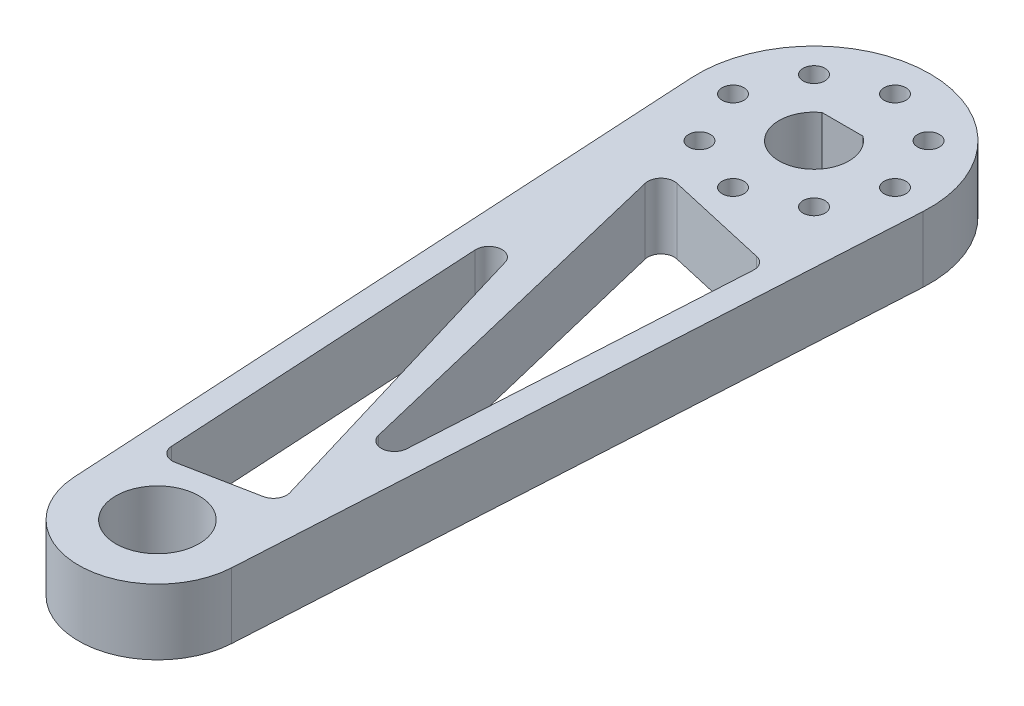
ISO-10303-21;
HEADER;
FILE_DESCRIPTION(('STEP AP214'),'2;1');
FILE_NAME('part.step','',(''),(''),'','','');
FILE_SCHEMA(('AUTOMOTIVE_DESIGN { 1 0 10303 214 1 1 1 1 }'));
ENDSEC;
DATA;
#1=APPLICATION_CONTEXT('core data for automotive mechanical design processes');
#2=APPLICATION_PROTOCOL_DEFINITION('international standard','automotive_design',2000,#1);
#3=PRODUCT_CONTEXT('',#1,'mechanical');
#4=PRODUCT('Part','Part','',(#3));
#5=PRODUCT_RELATED_PRODUCT_CATEGORY('part','',(#4));
#6=PRODUCT_DEFINITION_FORMATION('','',#4);
#7=PRODUCT_DEFINITION_CONTEXT('part definition',#1,'design');
#8=PRODUCT_DEFINITION('design','',#6,#7);
#9=PRODUCT_DEFINITION_SHAPE('','',#8);
#10=(LENGTH_UNIT() NAMED_UNIT(*) SI_UNIT(.MILLI.,.METRE.));
#11=(NAMED_UNIT(*) PLANE_ANGLE_UNIT() SI_UNIT($,.RADIAN.));
#12=(NAMED_UNIT(*) SI_UNIT($,.STERADIAN.) SOLID_ANGLE_UNIT());
#13=UNCERTAINTY_MEASURE_WITH_UNIT(LENGTH_MEASURE(1.E-05),#10,'distance_accuracy_value','');
#14=(GEOMETRIC_REPRESENTATION_CONTEXT(3) GLOBAL_UNCERTAINTY_ASSIGNED_CONTEXT((#13)) GLOBAL_UNIT_ASSIGNED_CONTEXT((#10,
#11,#12)) REPRESENTATION_CONTEXT('',''));
#15=CARTESIAN_POINT('',(0.,0.,0.));
#16=DIRECTION('',(0.,0.,1.));
#17=DIRECTION('',(1.,0.,0.));
#18=AXIS2_PLACEMENT_3D('',#15,#16,#17);
#19=CARTESIAN_POINT('',(0.,15.,0.));
#20=DIRECTION('',(0.,1.,0.));
#21=DIRECTION('',(0.,0.,1.));
#22=AXIS2_PLACEMENT_3D('',#19,#20,#21);
#23=PLANE('',#22);
#24=CARTESIAN_POINT('',(0.,15.,0.));
#25=DIRECTION('',(0.,1.,0.));
#26=DIRECTION('',(0.,0.,1.));
#27=AXIS2_PLACEMENT_3D('',#24,#25,#26);
#28=CIRCLE('',#27,9.5);
#29=CARTESIAN_POINT('',(0.,15.,9.5));
#30=VERTEX_POINT('',#29);
#31=EDGE_CURVE('E640',#30,#30,#28,.T.);
#32=ORIENTED_EDGE('',*,*,#31,.F.);
#33=EDGE_LOOP('',(#32));
#34=FACE_BOUND('',#33,.T.);
#35=CARTESIAN_POINT('',(-13.0814754519499,15.,-163.081475451949));
#36=DIRECTION('',(0.,1.,0.));
#37=DIRECTION('',(0.,0.,1.));
#38=AXIS2_PLACEMENT_3D('',#35,#36,#37);
#39=CIRCLE('',#38,2.49999999999997);
#40=CARTESIAN_POINT('',(-13.0814754519499,15.,-160.581475451949));
#41=VERTEX_POINT('',#40);
#42=EDGE_CURVE('E636',#41,#41,#39,.T.);
#43=ORIENTED_EDGE('',*,*,#42,.F.);
#44=EDGE_LOOP('',(#43));
#45=FACE_BOUND('',#44,.T.);
#46=CARTESIAN_POINT('',(-18.499999999997,15.,-149.999999999997));
#47=DIRECTION('',(0.,1.,0.));
#48=DIRECTION('',(0.,0.,1.));
#49=AXIS2_PLACEMENT_3D('',#46,#47,#48);
#50=CIRCLE('',#49,2.49999999999998);
#51=CARTESIAN_POINT('',(-18.499999999997,15.,-147.499999999997));
#52=VERTEX_POINT('',#51);
#53=EDGE_CURVE('E643',#52,#52,#50,.T.);
#54=ORIENTED_EDGE('',*,*,#53,.F.);
#55=EDGE_LOOP('',(#54));
#56=FACE_BOUND('',#55,.T.);
#57=CARTESIAN_POINT('',(-13.0814754519466,15.,-136.918524548047));
#58=DIRECTION('',(0.,1.,0.));
#59=DIRECTION('',(0.,0.,1.));
#60=AXIS2_PLACEMENT_3D('',#57,#58,#59);
#61=CIRCLE('',#60,2.5);
#62=CARTESIAN_POINT('',(-13.0814754519466,15.,-134.418524548047));
#63=VERTEX_POINT('',#62);
#64=EDGE_CURVE('E649',#63,#63,#61,.T.);
#65=ORIENTED_EDGE('',*,*,#64,.F.);
#66=EDGE_LOOP('',(#65));
#67=FACE_BOUND('',#66,.T.);
#68=CARTESIAN_POINT('',(5.16253706450698E-12,15.,-131.5));
#69=DIRECTION('',(0.,1.,0.));
#70=DIRECTION('',(0.,0.,1.));
#71=AXIS2_PLACEMENT_3D('',#68,#69,#70);
#72=CIRCLE('',#71,2.50000000000003);
#73=CARTESIAN_POINT('',(5.16253706450698E-12,15.,-129.));
#74=VERTEX_POINT('',#73);
#75=EDGE_CURVE('E655',#74,#74,#72,.T.);
#76=ORIENTED_EDGE('',*,*,#75,.F.);
#77=EDGE_LOOP('',(#76));
#78=FACE_BOUND('',#77,.T.);
#79=CARTESIAN_POINT('',(1.94289029309402E-13,15.,-168.5));
#80=DIRECTION('',(0.,1.,0.));
#81=DIRECTION('',(0.,0.,1.));
#82=AXIS2_PLACEMENT_3D('',#79,#80,#81);
#83=CIRCLE('',#82,2.49999999999999);
#84=CARTESIAN_POINT('',(1.94289029309402E-13,15.,-166.));
#85=VERTEX_POINT('',#84);
#86=EDGE_CURVE('E661',#85,#85,#83,.T.);
#87=ORIENTED_EDGE('',*,*,#86,.F.);
#88=EDGE_LOOP('',(#87));
#89=FACE_BOUND('',#88,.T.);
#90=CARTESIAN_POINT('',(13.0814754519556,15.,-136.918524548051));
#91=DIRECTION('',(0.,1.,0.));
#92=DIRECTION('',(0.,0.,1.));
#93=AXIS2_PLACEMENT_3D('',#90,#91,#92);
#94=CIRCLE('',#93,2.49999999999997);
#95=CARTESIAN_POINT('',(13.0814754519556,15.,-134.418524548051));
#96=VERTEX_POINT('',#95);
#97=EDGE_CURVE('E667',#96,#96,#94,.T.);
#98=ORIENTED_EDGE('',*,*,#97,.F.);
#99=EDGE_LOOP('',(#98));
#100=FACE_BOUND('',#99,.T.);
#101=CARTESIAN_POINT('',(18.5000000000028,15.,-150.000000000002));
#102=DIRECTION('',(0.,1.,0.));
#103=DIRECTION('',(0.,0.,1.));
#104=AXIS2_PLACEMENT_3D('',#101,#102,#103);
#105=CIRCLE('',#104,2.50000000000001);
#106=CARTESIAN_POINT('',(18.5000000000028,15.,-147.500000000002));
#107=VERTEX_POINT('',#106);
#108=EDGE_CURVE('E633',#107,#107,#105,.T.);
#109=ORIENTED_EDGE('',*,*,#108,.F.);
#110=EDGE_LOOP('',(#109));
#111=FACE_BOUND('',#110,.T.);
#112=CARTESIAN_POINT('',(13.0814754519523,15.,-163.081475451953));
#113=DIRECTION('',(0.,1.,0.));
#114=DIRECTION('',(0.,0.,1.));
#115=AXIS2_PLACEMENT_3D('',#112,#113,#114);
#116=CIRCLE('',#115,2.49999999999996);
#117=CARTESIAN_POINT('',(13.0814754519523,15.,-160.581475451953));
#118=VERTEX_POINT('',#117);
#119=EDGE_CURVE('E628',#118,#118,#116,.T.);
#120=ORIENTED_EDGE('',*,*,#119,.F.);
#121=EDGE_LOOP('',(#120));
#122=FACE_BOUND('',#121,.T.);
#123=CARTESIAN_POINT('',(0.,15.,0.));
#124=DIRECTION('',(0.,1.,0.));
#125=DIRECTION('',(0.,0.,1.));
#126=AXIS2_PLACEMENT_3D('',#123,#124,#125);
#127=CIRCLE('',#126,18.);
#128=CARTESIAN_POINT('',(-17.971076762398,15.,1.02));
#129=VERTEX_POINT('',#128);
#130=CARTESIAN_POINT('',(17.971076762398,15.,1.02));
#131=VERTEX_POINT('',#130);
#132=EDGE_CURVE('E221',#129,#131,#127,.T.);
#133=ORIENTED_EDGE('',*,*,#132,.T.);
#134=DIRECTION('',(0.0566666666666667,0.,-0.998393153466553));
#135=VECTOR('',#134,1.);
#136=CARTESIAN_POINT('',(17.971076762398,15.,1.02));
#137=LINE('',#136,#135);
#138=CARTESIAN_POINT('',(26.4574185668637,15.,-148.498333333333));
#139=VERTEX_POINT('',#138);
#140=EDGE_CURVE('E224',#131,#139,#137,.T.);
#141=ORIENTED_EDGE('',*,*,#140,.T.);
#142=CARTESIAN_POINT('',(0.,15.,-150.));
#143=DIRECTION('',(0.,1.,0.));
#144=DIRECTION('',(0.,0.,-1.));
#145=AXIS2_PLACEMENT_3D('',#142,#143,#144);
#146=CIRCLE('',#145,26.5);
#147=CARTESIAN_POINT('',(-26.4574185668637,15.,-148.498333333333));
#148=VERTEX_POINT('',#147);
#149=EDGE_CURVE('E227',#139,#148,#146,.T.);
#150=ORIENTED_EDGE('',*,*,#149,.T.);
#151=DIRECTION('',(0.0566666666666667,0.,0.998393153466553));
#152=VECTOR('',#151,1.);
#153=CARTESIAN_POINT('',(-17.971076762398,15.,1.02));
#154=LINE('',#153,#152);
#155=EDGE_CURVE('E229',#148,#129,#154,.T.);
#156=ORIENTED_EDGE('',*,*,#155,.T.);
#157=EDGE_LOOP('',(#133,#141,#150,#156));
#158=FACE_BOUND('',#157,.T.);
#159=DIRECTION('',(-0.286666756449605,0.,-0.958030360033889));
#160=VECTOR('',#159,1.);
#161=CARTESIAN_POINT('',(-18.5543851913669,15.,-115.139490738387));
#162=LINE('',#161,#160);
#163=CARTESIAN_POINT('',(9.76560528215196,15.,-20.4950645568282));
#164=VERTEX_POINT('',#163);
#165=CARTESIAN_POINT('',(-11.2390630531947,15.,-90.6919378076061));
#166=VERTEX_POINT('',#165);
#167=EDGE_CURVE('E206',#164,#166,#162,.T.);
#168=ORIENTED_EDGE('',*,*,#167,.F.);
#169=CARTESIAN_POINT('',(6.8915142020503,15.,-19.6350642874794));
#170=DIRECTION('',(0.,1.,0.));
#171=DIRECTION('',(0.,0.,1.));
#172=AXIS2_PLACEMENT_3D('',#169,#170,#171);
#173=CIRCLE('',#172,3.);
#174=CARTESIAN_POINT('',(7.47066200637673,15.,-16.6914970943031));
#175=VERTEX_POINT('',#174);
#176=EDGE_CURVE('E11',#164,#175,#173,.F.);
#177=ORIENTED_EDGE('',*,*,#176,.T.);
#178=DIRECTION('',(0.981189064392104,0.,-0.19304926810881));
#179=VECTOR('',#178,1.);
#180=CARTESIAN_POINT('',(10.7128519545465,15.,-17.3293990229714));
#181=LINE('',#180,#179);
#182=CARTESIAN_POINT('',(-9.3618110753663,15.,-13.3797025311371));
#183=VERTEX_POINT('',#182);
#184=EDGE_CURVE('E204',#183,#175,#181,.T.);
#185=ORIENTED_EDGE('',*,*,#184,.F.);
#186=CARTESIAN_POINT('',(-9.94095887969273,15.,-16.3232697243134));
#187=DIRECTION('',(0.,1.,0.));
#188=DIRECTION('',(0.,0.,1.));
#189=AXIS2_PLACEMENT_3D('',#186,#187,#188);
#190=CIRCLE('',#189,3.);
#191=CARTESIAN_POINT('',(-12.9361383400924,15.,-16.1532697243134));
#192=VERTEX_POINT('',#191);
#193=EDGE_CURVE('E293',#183,#192,#190,.F.);
#194=ORIENTED_EDGE('',*,*,#193,.T.);
#195=DIRECTION('',(0.0566666666666666,0.,0.998393153466553));
#196=VECTOR('',#195,1.);
#197=CARTESIAN_POINT('',(-12.7409809539486,15.,-12.7148497565296));
#198=LINE('',#197,#196);
#199=CARTESIAN_POINT('',(-17.108333593696,15.,-89.6619375382572));
#200=VERTEX_POINT('',#199);
#201=EDGE_CURVE('E210',#200,#192,#198,.T.);
#202=ORIENTED_EDGE('',*,*,#201,.F.);
#203=CARTESIAN_POINT('',(-14.1131541332963,15.,-89.8319375382572));
#204=DIRECTION('',(0.,1.,0.));
#205=DIRECTION('',(0.,0.,1.));
#206=AXIS2_PLACEMENT_3D('',#203,#204,#205);
#207=CIRCLE('',#206,3.);
#208=EDGE_CURVE('E289',#200,#166,#207,.F.);
#209=ORIENTED_EDGE('',*,*,#208,.T.);
#210=EDGE_LOOP('',(#168,#177,#185,#194,#202,#209));
#211=FACE_BOUND('',#210,.T.);
#212=DIRECTION('',(0.234668209936248,0.,0.972075527541619));
#213=VECTOR('',#212,1.);
#214=CARTESIAN_POINT('',(-12.,15.,-127.));
#215=LINE('',#214,#213);
#216=CARTESIAN_POINT('',(-10.8653488920019,15.,-122.299889257763));
#217=VERTEX_POINT('',#216);
#218=CARTESIAN_POINT('',(8.52161939319863,15.,-41.992473829023));
#219=VERTEX_POINT('',#218);
#220=EDGE_CURVE('E189',#217,#219,#215,.T.);
#221=ORIENTED_EDGE('',*,*,#220,.F.);
#222=CARTESIAN_POINT('',(-7.94912230937701,15.,-123.003893887571));
#223=DIRECTION('',(0.,1.,0.));
#224=DIRECTION('',(0.,0.,1.));
#225=AXIS2_PLACEMENT_3D('',#222,#223,#224);
#226=CIRCLE('',#225,3.);
#227=CARTESIAN_POINT('',(-7.28487950298156,15.,-125.929433409463));
#228=VERTEX_POINT('',#227);
#229=EDGE_CURVE('E285',#217,#228,#226,.F.);
#230=ORIENTED_EDGE('',*,*,#229,.T.);
#231=DIRECTION('',(-0.975179840630658,0.,-0.221414268798477));
#232=VECTOR('',#231,1.);
#233=CARTESIAN_POINT('',(18.8302573337206,15.,-120.));
#234=LINE('',#233,#232);
#235=CARTESIAN_POINT('',(16.3555160897141,15.,-120.561889202563));
#236=VERTEX_POINT('',#235);
#237=EDGE_CURVE('E186',#236,#228,#234,.T.);
#238=ORIENTED_EDGE('',*,*,#237,.F.);
#239=CARTESIAN_POINT('',(15.6912732833187,15.,-117.636349680671));
#240=DIRECTION('',(0.,1.,0.));
#241=DIRECTION('',(0.,0.,1.));
#242=AXIS2_PLACEMENT_3D('',#239,#240,#241);
#243=CIRCLE('',#242,3.);
#244=CARTESIAN_POINT('',(18.6864527437183,15.,-117.466349680671));
#245=VERTEX_POINT('',#244);
#246=EDGE_CURVE('E281',#236,#245,#243,.F.);
#247=ORIENTED_EDGE('',*,*,#246,.T.);
#248=DIRECTION('',(0.0566666666666667,0.,-0.998393153466553));
#249=VECTOR('',#248,1.);
#250=CARTESIAN_POINT('',(13.2832157063432,15.,-22.2683226570439));
#251=LINE('',#250,#249);
#252=CARTESIAN_POINT('',(14.4330254362231,15.,-42.5264784588318));
#253=VERTEX_POINT('',#252);
#254=EDGE_CURVE('E193',#253,#245,#251,.T.);
#255=ORIENTED_EDGE('',*,*,#254,.F.);
#256=CARTESIAN_POINT('',(11.4378459758235,15.,-42.6964784588318));
#257=DIRECTION('',(0.,1.,0.));
#258=DIRECTION('',(0.,0.,1.));
#259=AXIS2_PLACEMENT_3D('',#256,#257,#258);
#260=CIRCLE('',#259,3.);
#261=EDGE_CURVE('E297',#253,#219,#260,.F.);
#262=ORIENTED_EDGE('',*,*,#261,.T.);
#263=EDGE_LOOP('',(#221,#230,#238,#247,#255,#262));
#264=FACE_BOUND('',#263,.T.);
#265=DIRECTION('',(-1.,0.,0.));
#266=VECTOR('',#265,1.);
#267=CARTESIAN_POINT('',(0.,15.,-156.5));
#268=LINE('',#267,#266);
#269=CARTESIAN_POINT('',(4.6636895265444,15.,-156.5));
#270=VERTEX_POINT('',#269);
#271=CARTESIAN_POINT('',(-4.6636895265444,15.,-156.5));
#272=VERTEX_POINT('',#271);
#273=EDGE_CURVE('E159',#270,#272,#268,.T.);
#274=ORIENTED_EDGE('',*,*,#273,.F.);
#275=CARTESIAN_POINT('',(0.,15.,-150.));
#276=DIRECTION('',(0.,1.,0.));
#277=DIRECTION('',(0.,0.,1.));
#278=AXIS2_PLACEMENT_3D('',#275,#276,#277);
#279=CIRCLE('',#278,8.);
#280=EDGE_CURVE('E169',#272,#270,#279,.T.);
#281=ORIENTED_EDGE('',*,*,#280,.F.);
#282=EDGE_LOOP('',(#274,#281));
#283=FACE_BOUND('',#282,.T.);
#284=ADVANCED_FACE('F35',(#34,#45,#56,#67,#78,#89,#100,#111,#122,#158,#211,#264,#283),#23,.T.);
#285=CARTESIAN_POINT('',(0.,0.,0.));
#286=DIRECTION('',(0.,1.,0.));
#287=DIRECTION('',(0.,0.,1.));
#288=AXIS2_PLACEMENT_3D('',#285,#286,#287);
#289=PLANE('',#288);
#290=CARTESIAN_POINT('',(0.,0.,0.));
#291=DIRECTION('',(0.,-1.,0.));
#292=DIRECTION('',(0.,0.,-1.));
#293=AXIS2_PLACEMENT_3D('',#290,#291,#292);
#294=CIRCLE('',#293,9.5);
#295=CARTESIAN_POINT('',(0.,0.,-9.5));
#296=VERTEX_POINT('',#295);
#297=EDGE_CURVE('E677',#296,#296,#294,.T.);
#298=ORIENTED_EDGE('',*,*,#297,.F.);
#299=EDGE_LOOP('',(#298));
#300=FACE_BOUND('',#299,.T.);
#301=CARTESIAN_POINT('',(-13.0814754519499,0.,-163.081475451949));
#302=DIRECTION('',(0.,1.,0.));
#303=DIRECTION('',(0.,0.,1.));
#304=AXIS2_PLACEMENT_3D('',#301,#302,#303);
#305=CIRCLE('',#304,2.49999999999997);
#306=CARTESIAN_POINT('',(-13.0814754519499,0.,-160.581475451949));
#307=VERTEX_POINT('',#306);
#308=EDGE_CURVE('E639',#307,#307,#305,.T.);
#309=ORIENTED_EDGE('',*,*,#308,.T.);
#310=EDGE_LOOP('',(#309));
#311=FACE_BOUND('',#310,.T.);
#312=CARTESIAN_POINT('',(-18.499999999997,0.,-149.999999999997));
#313=DIRECTION('',(0.,1.,0.));
#314=DIRECTION('',(0.,0.,1.));
#315=AXIS2_PLACEMENT_3D('',#312,#313,#314);
#316=CIRCLE('',#315,2.49999999999998);
#317=CARTESIAN_POINT('',(-18.499999999997,0.,-147.499999999997));
#318=VERTEX_POINT('',#317);
#319=EDGE_CURVE('E646',#318,#318,#316,.T.);
#320=ORIENTED_EDGE('',*,*,#319,.T.);
#321=EDGE_LOOP('',(#320));
#322=FACE_BOUND('',#321,.T.);
#323=CARTESIAN_POINT('',(-13.0814754519466,0.,-136.918524548047));
#324=DIRECTION('',(0.,1.,0.));
#325=DIRECTION('',(0.,0.,1.));
#326=AXIS2_PLACEMENT_3D('',#323,#324,#325);
#327=CIRCLE('',#326,2.5);
#328=CARTESIAN_POINT('',(-13.0814754519466,0.,-134.418524548047));
#329=VERTEX_POINT('',#328);
#330=EDGE_CURVE('E652',#329,#329,#327,.T.);
#331=ORIENTED_EDGE('',*,*,#330,.T.);
#332=EDGE_LOOP('',(#331));
#333=FACE_BOUND('',#332,.T.);
#334=CARTESIAN_POINT('',(5.16253706450698E-12,0.,-131.5));
#335=DIRECTION('',(0.,1.,0.));
#336=DIRECTION('',(0.,0.,1.));
#337=AXIS2_PLACEMENT_3D('',#334,#335,#336);
#338=CIRCLE('',#337,2.50000000000003);
#339=CARTESIAN_POINT('',(5.16253706450698E-12,0.,-129.));
#340=VERTEX_POINT('',#339);
#341=EDGE_CURVE('E658',#340,#340,#338,.T.);
#342=ORIENTED_EDGE('',*,*,#341,.T.);
#343=EDGE_LOOP('',(#342));
#344=FACE_BOUND('',#343,.T.);
#345=CARTESIAN_POINT('',(1.94289029309402E-13,0.,-168.5));
#346=DIRECTION('',(0.,1.,0.));
#347=DIRECTION('',(0.,0.,1.));
#348=AXIS2_PLACEMENT_3D('',#345,#346,#347);
#349=CIRCLE('',#348,2.49999999999999);
#350=CARTESIAN_POINT('',(1.94289029309402E-13,0.,-166.));
#351=VERTEX_POINT('',#350);
#352=EDGE_CURVE('E664',#351,#351,#349,.T.);
#353=ORIENTED_EDGE('',*,*,#352,.T.);
#354=EDGE_LOOP('',(#353));
#355=FACE_BOUND('',#354,.T.);
#356=CARTESIAN_POINT('',(13.0814754519556,0.,-136.918524548051));
#357=DIRECTION('',(0.,1.,0.));
#358=DIRECTION('',(0.,0.,1.));
#359=AXIS2_PLACEMENT_3D('',#356,#357,#358);
#360=CIRCLE('',#359,2.49999999999997);
#361=CARTESIAN_POINT('',(13.0814754519556,0.,-134.418524548051));
#362=VERTEX_POINT('',#361);
#363=EDGE_CURVE('E670',#362,#362,#360,.T.);
#364=ORIENTED_EDGE('',*,*,#363,.T.);
#365=EDGE_LOOP('',(#364));
#366=FACE_BOUND('',#365,.T.);
#367=CARTESIAN_POINT('',(18.5000000000028,0.,-150.000000000002));
#368=DIRECTION('',(0.,1.,0.));
#369=DIRECTION('',(0.,0.,1.));
#370=AXIS2_PLACEMENT_3D('',#367,#368,#369);
#371=CIRCLE('',#370,2.50000000000001);
#372=CARTESIAN_POINT('',(18.5000000000028,0.,-147.500000000002));
#373=VERTEX_POINT('',#372);
#374=EDGE_CURVE('E630',#373,#373,#371,.T.);
#375=ORIENTED_EDGE('',*,*,#374,.T.);
#376=EDGE_LOOP('',(#375));
#377=FACE_BOUND('',#376,.T.);
#378=CARTESIAN_POINT('',(13.0814754519523,0.,-163.081475451953));
#379=DIRECTION('',(0.,1.,0.));
#380=DIRECTION('',(0.,0.,1.));
#381=AXIS2_PLACEMENT_3D('',#378,#379,#380);
#382=CIRCLE('',#381,2.49999999999996);
#383=CARTESIAN_POINT('',(13.0814754519523,0.,-160.581475451953));
#384=VERTEX_POINT('',#383);
#385=EDGE_CURVE('E184',#384,#384,#382,.T.);
#386=ORIENTED_EDGE('',*,*,#385,.T.);
#387=EDGE_LOOP('',(#386));
#388=FACE_BOUND('',#387,.T.);
#389=DIRECTION('',(0.0566666666666667,0.,-0.998393153466553));
#390=VECTOR('',#389,1.);
#391=CARTESIAN_POINT('',(13.2832157063432,0.,-22.2683226570439));
#392=LINE('',#391,#390);
#393=CARTESIAN_POINT('',(14.4330254362231,0.,-42.5264784588318));
#394=VERTEX_POINT('',#393);
#395=CARTESIAN_POINT('',(18.6864527437183,0.,-117.466349680671));
#396=VERTEX_POINT('',#395);
#397=EDGE_CURVE('E190',#394,#396,#392,.T.);
#398=ORIENTED_EDGE('',*,*,#397,.T.);
#399=CARTESIAN_POINT('',(15.6912732833187,0.,-117.636349680671));
#400=DIRECTION('',(0.,1.,0.));
#401=DIRECTION('',(0.,0.,1.));
#402=AXIS2_PLACEMENT_3D('',#399,#400,#401);
#403=CIRCLE('',#402,3.);
#404=CARTESIAN_POINT('',(16.3555160897141,0.,-120.561889202563));
#405=VERTEX_POINT('',#404);
#406=EDGE_CURVE('E279',#396,#405,#403,.T.);
#407=ORIENTED_EDGE('',*,*,#406,.T.);
#408=DIRECTION('',(-0.975179840630658,0.,-0.221414268798477));
#409=VECTOR('',#408,1.);
#410=CARTESIAN_POINT('',(18.8302573337206,0.,-120.));
#411=LINE('',#410,#409);
#412=CARTESIAN_POINT('',(-7.28487950298156,0.,-125.929433409463));
#413=VERTEX_POINT('',#412);
#414=EDGE_CURVE('E177',#405,#413,#411,.T.);
#415=ORIENTED_EDGE('',*,*,#414,.T.);
#416=CARTESIAN_POINT('',(-7.94912230937701,0.,-123.003893887571));
#417=DIRECTION('',(0.,1.,0.));
#418=DIRECTION('',(0.,0.,1.));
#419=AXIS2_PLACEMENT_3D('',#416,#417,#418);
#420=CIRCLE('',#419,3.);
#421=CARTESIAN_POINT('',(-10.8653488920019,0.,-122.299889257763));
#422=VERTEX_POINT('',#421);
#423=EDGE_CURVE('E283',#413,#422,#420,.T.);
#424=ORIENTED_EDGE('',*,*,#423,.T.);
#425=DIRECTION('',(0.234668209936248,0.,0.972075527541619));
#426=VECTOR('',#425,1.);
#427=CARTESIAN_POINT('',(-12.,0.,-127.));
#428=LINE('',#427,#426);
#429=CARTESIAN_POINT('',(8.52161939319863,0.,-41.992473829023));
#430=VERTEX_POINT('',#429);
#431=EDGE_CURVE('E199',#422,#430,#428,.T.);
#432=ORIENTED_EDGE('',*,*,#431,.T.);
#433=CARTESIAN_POINT('',(11.4378459758235,0.,-42.6964784588318));
#434=DIRECTION('',(0.,1.,0.));
#435=DIRECTION('',(0.,0.,1.));
#436=AXIS2_PLACEMENT_3D('',#433,#434,#435);
#437=CIRCLE('',#436,3.);
#438=EDGE_CURVE('E295',#430,#394,#437,.T.);
#439=ORIENTED_EDGE('',*,*,#438,.T.);
#440=EDGE_LOOP('',(#398,#407,#415,#424,#432,#439));
#441=FACE_BOUND('',#440,.T.);
#442=CARTESIAN_POINT('',(0.,0.,0.));
#443=DIRECTION('',(0.,1.,0.));
#444=DIRECTION('',(0.,0.,1.));
#445=AXIS2_PLACEMENT_3D('',#442,#443,#444);
#446=CIRCLE('',#445,18.);
#447=CARTESIAN_POINT('',(-17.971076762398,0.,1.02));
#448=VERTEX_POINT('',#447);
#449=CARTESIAN_POINT('',(17.971076762398,0.,1.02));
#450=VERTEX_POINT('',#449);
#451=EDGE_CURVE('E213',#448,#450,#446,.T.);
#452=ORIENTED_EDGE('',*,*,#451,.F.);
#453=DIRECTION('',(0.0566666666666667,0.,0.998393153466553));
#454=VECTOR('',#453,1.);
#455=CARTESIAN_POINT('',(-17.971076762398,0.,1.02));
#456=LINE('',#455,#454);
#457=CARTESIAN_POINT('',(-26.4574185668637,0.,-148.498333333333));
#458=VERTEX_POINT('',#457);
#459=EDGE_CURVE('E225',#458,#448,#456,.T.);
#460=ORIENTED_EDGE('',*,*,#459,.F.);
#461=CARTESIAN_POINT('',(0.,0.,-150.));
#462=DIRECTION('',(0.,1.,0.));
#463=DIRECTION('',(0.,0.,-1.));
#464=AXIS2_PLACEMENT_3D('',#461,#462,#463);
#465=CIRCLE('',#464,26.5);
#466=CARTESIAN_POINT('',(26.4574185668637,0.,-148.498333333333));
#467=VERTEX_POINT('',#466);
#468=EDGE_CURVE('E236',#467,#458,#465,.T.);
#469=ORIENTED_EDGE('',*,*,#468,.F.);
#470=DIRECTION('',(0.0566666666666667,0.,-0.998393153466553));
#471=VECTOR('',#470,1.);
#472=CARTESIAN_POINT('',(17.971076762398,0.,1.02));
#473=LINE('',#472,#471);
#474=EDGE_CURVE('E234',#450,#467,#473,.T.);
#475=ORIENTED_EDGE('',*,*,#474,.F.);
#476=EDGE_LOOP('',(#452,#460,#469,#475));
#477=FACE_BOUND('',#476,.T.);
#478=DIRECTION('',(0.0566666666666666,0.,0.998393153466553));
#479=VECTOR('',#478,1.);
#480=CARTESIAN_POINT('',(-12.7409809539486,0.,-12.7148497565296));
#481=LINE('',#480,#479);
#482=CARTESIAN_POINT('',(-17.108333593696,0.,-89.6619375382572));
#483=VERTEX_POINT('',#482);
#484=CARTESIAN_POINT('',(-12.9361383400924,0.,-16.1532697243134));
#485=VERTEX_POINT('',#484);
#486=EDGE_CURVE('E207',#483,#485,#481,.T.);
#487=ORIENTED_EDGE('',*,*,#486,.T.);
#488=CARTESIAN_POINT('',(-9.94095887969273,0.,-16.3232697243134));
#489=DIRECTION('',(0.,1.,0.));
#490=DIRECTION('',(0.,0.,1.));
#491=AXIS2_PLACEMENT_3D('',#488,#489,#490);
#492=CIRCLE('',#491,3.);
#493=CARTESIAN_POINT('',(-9.3618110753663,0.,-13.3797025311371));
#494=VERTEX_POINT('',#493);
#495=EDGE_CURVE('E291',#485,#494,#492,.T.);
#496=ORIENTED_EDGE('',*,*,#495,.T.);
#497=DIRECTION('',(0.981189064392104,0.,-0.19304926810881));
#498=VECTOR('',#497,1.);
#499=CARTESIAN_POINT('',(10.7128519545465,0.,-17.3293990229714));
#500=LINE('',#499,#498);
#501=CARTESIAN_POINT('',(7.47066200637673,0.,-16.6914970943031));
#502=VERTEX_POINT('',#501);
#503=EDGE_CURVE('E196',#494,#502,#500,.T.);
#504=ORIENTED_EDGE('',*,*,#503,.T.);
#505=CARTESIAN_POINT('',(6.8915142020503,0.,-19.6350642874794));
#506=DIRECTION('',(0.,1.,0.));
#507=DIRECTION('',(0.,0.,1.));
#508=AXIS2_PLACEMENT_3D('',#505,#506,#507);
#509=CIRCLE('',#508,3.);
#510=CARTESIAN_POINT('',(9.76560528215196,0.,-20.4950645568282));
#511=VERTEX_POINT('',#510);
#512=EDGE_CURVE('E43',#502,#511,#509,.T.);
#513=ORIENTED_EDGE('',*,*,#512,.T.);
#514=DIRECTION('',(-0.286666756449605,0.,-0.958030360033889));
#515=VECTOR('',#514,1.);
#516=CARTESIAN_POINT('',(-18.5543851913669,0.,-115.139490738387));
#517=LINE('',#516,#515);
#518=CARTESIAN_POINT('',(-11.2390630531947,0.,-90.6919378076061));
#519=VERTEX_POINT('',#518);
#520=EDGE_CURVE('E216',#511,#519,#517,.T.);
#521=ORIENTED_EDGE('',*,*,#520,.T.);
#522=CARTESIAN_POINT('',(-14.1131541332963,0.,-89.8319375382572));
#523=DIRECTION('',(0.,1.,0.));
#524=DIRECTION('',(0.,0.,1.));
#525=AXIS2_PLACEMENT_3D('',#522,#523,#524);
#526=CIRCLE('',#525,3.);
#527=EDGE_CURVE('E287',#519,#483,#526,.T.);
#528=ORIENTED_EDGE('',*,*,#527,.T.);
#529=EDGE_LOOP('',(#487,#496,#504,#513,#521,#528));
#530=FACE_BOUND('',#529,.T.);
#531=CARTESIAN_POINT('',(0.,0.,-150.));
#532=DIRECTION('',(0.,1.,0.));
#533=DIRECTION('',(0.,0.,1.));
#534=AXIS2_PLACEMENT_3D('',#531,#532,#533);
#535=CIRCLE('',#534,8.);
#536=CARTESIAN_POINT('',(-4.6636895265444,0.,-156.5));
#537=VERTEX_POINT('',#536);
#538=CARTESIAN_POINT('',(4.6636895265444,0.,-156.5));
#539=VERTEX_POINT('',#538);
#540=EDGE_CURVE('E175',#537,#539,#535,.T.);
#541=ORIENTED_EDGE('',*,*,#540,.T.);
#542=DIRECTION('',(-1.,0.,0.));
#543=VECTOR('',#542,1.);
#544=CARTESIAN_POINT('',(0.,0.,-156.5));
#545=LINE('',#544,#543);
#546=EDGE_CURVE('E170',#539,#537,#545,.T.);
#547=ORIENTED_EDGE('',*,*,#546,.T.);
#548=EDGE_LOOP('',(#541,#547));
#549=FACE_BOUND('',#548,.T.);
#550=ADVANCED_FACE('F300',(#300,#311,#322,#333,#344,#355,#366,#377,#388,#441,#477,#530,#549),
#289,.F.);
#551=CARTESIAN_POINT('',(0.,15.,0.));
#552=DIRECTION('',(0.,-1.,0.));
#553=DIRECTION('',(0.,0.,-1.));
#554=AXIS2_PLACEMENT_3D('',#551,#552,#553);
#555=CYLINDRICAL_SURFACE('',#554,18.);
#556=ORIENTED_EDGE('',*,*,#451,.T.);
#557=DIRECTION('',(0.,-1.,0.));
#558=VECTOR('',#557,1.);
#559=CARTESIAN_POINT('',(17.971076762398,15.,1.02));
#560=LINE('',#559,#558);
#561=EDGE_CURVE('E247',#131,#450,#560,.T.);
#562=ORIENTED_EDGE('',*,*,#561,.F.);
#563=ORIENTED_EDGE('',*,*,#132,.F.);
#564=DIRECTION('',(0.,-1.,0.));
#565=VECTOR('',#564,1.);
#566=CARTESIAN_POINT('',(-17.971076762398,15.,1.02));
#567=LINE('',#566,#565);
#568=EDGE_CURVE('E231',#129,#448,#567,.T.);
#569=ORIENTED_EDGE('',*,*,#568,.T.);
#570=EDGE_LOOP('',(#556,#562,#563,#569));
#571=FACE_BOUND('',#570,.T.);
#572=ADVANCED_FACE('F340',(#571),#555,.T.);
#573=CARTESIAN_POINT('',(17.971076762398,15.,1.02));
#574=DIRECTION('',(-0.998393153466554,0.,-0.0566666666666667));
#575=DIRECTION('',(-0.0566666666666667,0.,0.998393153466554));
#576=AXIS2_PLACEMENT_3D('',#573,#574,#575);
#577=PLANE('',#576);
#578=ORIENTED_EDGE('',*,*,#474,.T.);
#579=DIRECTION('',(0.,-1.,0.));
#580=VECTOR('',#579,1.);
#581=CARTESIAN_POINT('',(26.4574185668637,15.,-148.498333333333));
#582=LINE('',#581,#580);
#583=EDGE_CURVE('E244',#139,#467,#582,.T.);
#584=ORIENTED_EDGE('',*,*,#583,.F.);
#585=ORIENTED_EDGE('',*,*,#140,.F.);
#586=ORIENTED_EDGE('',*,*,#561,.T.);
#587=EDGE_LOOP('',(#578,#584,#585,#586));
#588=FACE_BOUND('',#587,.T.);
#589=ADVANCED_FACE('F355',(#588),#577,.F.);
#590=CARTESIAN_POINT('',(0.,15.,-150.));
#591=DIRECTION('',(0.,-1.,0.));
#592=DIRECTION('',(0.,0.,-1.));
#593=AXIS2_PLACEMENT_3D('',#590,#591,#592);
#594=CYLINDRICAL_SURFACE('',#593,26.5);
#595=ORIENTED_EDGE('',*,*,#468,.T.);
#596=DIRECTION('',(0.,-1.,0.));
#597=VECTOR('',#596,1.);
#598=CARTESIAN_POINT('',(-26.4574185668637,15.,-148.498333333333));
#599=LINE('',#598,#597);
#600=EDGE_CURVE('E241',#148,#458,#599,.T.);
#601=ORIENTED_EDGE('',*,*,#600,.F.);
#602=ORIENTED_EDGE('',*,*,#149,.F.);
#603=ORIENTED_EDGE('',*,*,#583,.T.);
#604=EDGE_LOOP('',(#595,#601,#602,#603));
#605=FACE_BOUND('',#604,.T.);
#606=ADVANCED_FACE('F351',(#605),#594,.T.);
#607=CARTESIAN_POINT('',(-17.971076762398,15.,1.02));
#608=DIRECTION('',(0.998393153466554,0.,-0.0566666666666667));
#609=DIRECTION('',(-0.0566666666666667,0.,-0.998393153466554));
#610=AXIS2_PLACEMENT_3D('',#607,#608,#609);
#611=PLANE('',#610);
#612=ORIENTED_EDGE('',*,*,#459,.T.);
#613=ORIENTED_EDGE('',*,*,#568,.F.);
#614=ORIENTED_EDGE('',*,*,#155,.F.);
#615=ORIENTED_EDGE('',*,*,#600,.T.);
#616=EDGE_LOOP('',(#612,#613,#614,#615));
#617=FACE_BOUND('',#616,.T.);
#618=ADVANCED_FACE('F348',(#617),#611,.F.);
#619=CARTESIAN_POINT('',(10.7128519545465,15.,-17.3293990229714));
#620=DIRECTION('',(-0.19304926810881,0.,-0.981189064392104));
#621=DIRECTION('',(-0.981189064392104,0.,0.19304926810881));
#622=AXIS2_PLACEMENT_3D('',#619,#620,#621);
#623=PLANE('',#622);
#624=ORIENTED_EDGE('',*,*,#503,.F.);
#625=DIRECTION('',(0.,-1.,0.));
#626=VECTOR('',#625,1.);
#627=CARTESIAN_POINT('',(-9.3618110753663,15.,-13.3797025311371));
#628=LINE('',#627,#626);
#629=EDGE_CURVE('E55',#494,#183,#628,.F.);
#630=ORIENTED_EDGE('',*,*,#629,.T.);
#631=ORIENTED_EDGE('',*,*,#184,.T.);
#632=DIRECTION('',(0.,-1.,0.));
#633=VECTOR('',#632,1.);
#634=CARTESIAN_POINT('',(7.47066200637673,0.,-16.6914970943031));
#635=LINE('',#634,#633);
#636=EDGE_CURVE('E275',#175,#502,#635,.T.);
#637=ORIENTED_EDGE('',*,*,#636,.T.);
#638=EDGE_LOOP('',(#624,#630,#631,#637));
#639=FACE_BOUND('',#638,.T.);
#640=ADVANCED_FACE('F308',(#639),#623,.T.);
#641=CARTESIAN_POINT('',(-18.5543851913669,15.,-115.139490738387));
#642=DIRECTION('',(-0.958030360033889,0.,0.286666756449605));
#643=DIRECTION('',(0.286666756449605,0.,0.958030360033889));
#644=AXIS2_PLACEMENT_3D('',#641,#642,#643);
#645=PLANE('',#644);
#646=ORIENTED_EDGE('',*,*,#167,.T.);
#647=DIRECTION('',(0.,-1.,0.));
#648=VECTOR('',#647,1.);
#649=CARTESIAN_POINT('',(-11.2390630531947,0.,-90.6919378076061));
#650=LINE('',#649,#648);
#651=EDGE_CURVE('E267',#166,#519,#650,.T.);
#652=ORIENTED_EDGE('',*,*,#651,.T.);
#653=ORIENTED_EDGE('',*,*,#520,.F.);
#654=DIRECTION('',(0.,-1.,0.));
#655=VECTOR('',#654,1.);
#656=CARTESIAN_POINT('',(9.76560528215196,15.,-20.4950645568282));
#657=LINE('',#656,#655);
#658=EDGE_CURVE('E265',#511,#164,#657,.F.);
#659=ORIENTED_EDGE('',*,*,#658,.T.);
#660=EDGE_LOOP('',(#646,#652,#653,#659));
#661=FACE_BOUND('',#660,.T.);
#662=ADVANCED_FACE('F306',(#661),#645,.T.);
#663=CARTESIAN_POINT('',(-12.7409809539486,15.,-12.7148497565296));
#664=DIRECTION('',(0.998393153466553,0.,-0.0566666666666666));
#665=DIRECTION('',(-0.0566666666666666,0.,-0.998393153466553));
#666=AXIS2_PLACEMENT_3D('',#663,#664,#665);
#667=PLANE('',#666);
#668=ORIENTED_EDGE('',*,*,#486,.F.);
#669=DIRECTION('',(0.,-1.,0.));
#670=VECTOR('',#669,1.);
#671=CARTESIAN_POINT('',(-17.108333593696,15.,-89.6619375382572));
#672=LINE('',#671,#670);
#673=EDGE_CURVE('E273',#483,#200,#672,.F.);
#674=ORIENTED_EDGE('',*,*,#673,.T.);
#675=ORIENTED_EDGE('',*,*,#201,.T.);
#676=DIRECTION('',(0.,-1.,0.));
#677=VECTOR('',#676,1.);
#678=CARTESIAN_POINT('',(-12.9361383400924,0.,-16.1532697243134));
#679=LINE('',#678,#677);
#680=EDGE_CURVE('E270',#192,#485,#679,.T.);
#681=ORIENTED_EDGE('',*,*,#680,.T.);
#682=EDGE_LOOP('',(#668,#674,#675,#681));
#683=FACE_BOUND('',#682,.T.);
#684=ADVANCED_FACE('F317',(#683),#667,.T.);
#685=CARTESIAN_POINT('',(18.8302573337206,15.,-120.));
#686=DIRECTION('',(-0.221414268798477,0.,0.975179840630658));
#687=DIRECTION('',(0.975179840630658,0.,0.221414268798477));
#688=AXIS2_PLACEMENT_3D('',#685,#686,#687);
#689=PLANE('',#688);
#690=ORIENTED_EDGE('',*,*,#414,.F.);
#691=DIRECTION('',(0.,-1.,0.));
#692=VECTOR('',#691,1.);
#693=CARTESIAN_POINT('',(16.3555160897141,15.,-120.561889202563));
#694=LINE('',#693,#692);
#695=EDGE_CURVE('E258',#405,#236,#694,.F.);
#696=ORIENTED_EDGE('',*,*,#695,.T.);
#697=ORIENTED_EDGE('',*,*,#237,.T.);
#698=DIRECTION('',(0.,-1.,0.));
#699=VECTOR('',#698,1.);
#700=CARTESIAN_POINT('',(-7.28487950298158,0.,-125.929433409463));
#701=LINE('',#700,#699);
#702=EDGE_CURVE('E255',#228,#413,#701,.T.);
#703=ORIENTED_EDGE('',*,*,#702,.T.);
#704=EDGE_LOOP('',(#690,#696,#697,#703));
#705=FACE_BOUND('',#704,.T.);
#706=ADVANCED_FACE('F390',(#705),#689,.T.);
#707=CARTESIAN_POINT('',(-12.,15.,-127.));
#708=DIRECTION('',(0.972075527541619,0.,-0.234668209936247));
#709=DIRECTION('',(-0.234668209936248,0.,-0.972075527541619));
#710=AXIS2_PLACEMENT_3D('',#707,#708,#709);
#711=PLANE('',#710);
#712=ORIENTED_EDGE('',*,*,#431,.F.);
#713=DIRECTION('',(0.,-1.,0.));
#714=VECTOR('',#713,1.);
#715=CARTESIAN_POINT('',(-10.8653488920019,15.,-122.299889257763));
#716=LINE('',#715,#714);
#717=EDGE_CURVE('E263',#422,#217,#716,.F.);
#718=ORIENTED_EDGE('',*,*,#717,.T.);
#719=ORIENTED_EDGE('',*,*,#220,.T.);
#720=DIRECTION('',(0.,-1.,0.));
#721=VECTOR('',#720,1.);
#722=CARTESIAN_POINT('',(8.52161939319862,0.,-41.992473829023));
#723=LINE('',#722,#721);
#724=EDGE_CURVE('E260',#219,#430,#723,.T.);
#725=ORIENTED_EDGE('',*,*,#724,.T.);
#726=EDGE_LOOP('',(#712,#718,#719,#725));
#727=FACE_BOUND('',#726,.T.);
#728=ADVANCED_FACE('F385',(#727),#711,.T.);
#729=CARTESIAN_POINT('',(13.2832157063432,15.,-22.2683226570439));
#730=DIRECTION('',(-0.998393153466553,0.,-0.0566666666666667));
#731=DIRECTION('',(-0.0566666666666667,0.,0.998393153466553));
#732=AXIS2_PLACEMENT_3D('',#729,#730,#731);
#733=PLANE('',#732);
#734=ORIENTED_EDGE('',*,*,#254,.T.);
#735=DIRECTION('',(0.,-1.,0.));
#736=VECTOR('',#735,1.);
#737=CARTESIAN_POINT('',(18.6864527437183,0.,-117.466349680671));
#738=LINE('',#737,#736);
#739=EDGE_CURVE('E252',#245,#396,#738,.T.);
#740=ORIENTED_EDGE('',*,*,#739,.T.);
#741=ORIENTED_EDGE('',*,*,#397,.F.);
#742=DIRECTION('',(0.,-1.,0.));
#743=VECTOR('',#742,1.);
#744=CARTESIAN_POINT('',(14.4330254362231,15.,-42.5264784588318));
#745=LINE('',#744,#743);
#746=EDGE_CURVE('E250',#394,#253,#745,.F.);
#747=ORIENTED_EDGE('',*,*,#746,.T.);
#748=EDGE_LOOP('',(#734,#740,#741,#747));
#749=FACE_BOUND('',#748,.T.);
#750=ADVANCED_FACE('F377',(#749),#733,.T.);
#751=CARTESIAN_POINT('',(0.,15.,-150.));
#752=DIRECTION('',(0.,-1.,0.));
#753=DIRECTION('',(0.,0.,-1.));
#754=AXIS2_PLACEMENT_3D('',#751,#752,#753);
#755=CYLINDRICAL_SURFACE('',#754,8.);
#756=ORIENTED_EDGE('',*,*,#540,.F.);
#757=DIRECTION('',(0.,-1.,0.));
#758=VECTOR('',#757,1.);
#759=CARTESIAN_POINT('',(-4.6636895265444,15.,-156.5));
#760=LINE('',#759,#758);
#761=EDGE_CURVE('E163',#272,#537,#760,.T.);
#762=ORIENTED_EDGE('',*,*,#761,.F.);
#763=ORIENTED_EDGE('',*,*,#280,.T.);
#764=DIRECTION('',(0.,-1.,0.));
#765=VECTOR('',#764,1.);
#766=CARTESIAN_POINT('',(4.6636895265444,15.,-156.5));
#767=LINE('',#766,#765);
#768=EDGE_CURVE('E165',#270,#539,#767,.T.);
#769=ORIENTED_EDGE('',*,*,#768,.T.);
#770=EDGE_LOOP('',(#756,#762,#763,#769));
#771=FACE_BOUND('',#770,.T.);
#772=ADVANCED_FACE('F173',(#771),#755,.F.);
#773=CARTESIAN_POINT('',(0.,15.,-156.5));
#774=DIRECTION('',(0.,0.,1.));
#775=DIRECTION('',(1.,0.,0.));
#776=AXIS2_PLACEMENT_3D('',#773,#774,#775);
#777=PLANE('',#776);
#778=ORIENTED_EDGE('',*,*,#546,.F.);
#779=ORIENTED_EDGE('',*,*,#768,.F.);
#780=ORIENTED_EDGE('',*,*,#273,.T.);
#781=ORIENTED_EDGE('',*,*,#761,.T.);
#782=EDGE_LOOP('',(#778,#779,#780,#781));
#783=FACE_BOUND('',#782,.T.);
#784=ADVANCED_FACE('F162',(#783),#777,.T.);
#785=CARTESIAN_POINT('',(15.6912732833187,15.,-117.636349680671));
#786=DIRECTION('',(0.,1.,0.));
#787=DIRECTION('',(0.,0.,1.));
#788=AXIS2_PLACEMENT_3D('',#785,#786,#787);
#789=CYLINDRICAL_SURFACE('',#788,3.);
#790=ORIENTED_EDGE('',*,*,#246,.F.);
#791=ORIENTED_EDGE('',*,*,#695,.F.);
#792=ORIENTED_EDGE('',*,*,#406,.F.);
#793=ORIENTED_EDGE('',*,*,#739,.F.);
#794=EDGE_LOOP('',(#790,#791,#792,#793));
#795=FACE_BOUND('',#794,.T.);
#796=ADVANCED_FACE('F331',(#795),#789,.F.);
#797=CARTESIAN_POINT('',(-7.94912230937701,15.,-123.003893887571));
#798=DIRECTION('',(0.,1.,0.));
#799=DIRECTION('',(0.,0.,1.));
#800=AXIS2_PLACEMENT_3D('',#797,#798,#799);
#801=CYLINDRICAL_SURFACE('',#800,3.);
#802=ORIENTED_EDGE('',*,*,#229,.F.);
#803=ORIENTED_EDGE('',*,*,#717,.F.);
#804=ORIENTED_EDGE('',*,*,#423,.F.);
#805=ORIENTED_EDGE('',*,*,#702,.F.);
#806=EDGE_LOOP('',(#802,#803,#804,#805));
#807=FACE_BOUND('',#806,.T.);
#808=ADVANCED_FACE('F323',(#807),#801,.F.);
#809=CARTESIAN_POINT('',(-14.1131541332963,15.,-89.8319375382572));
#810=DIRECTION('',(0.,1.,0.));
#811=DIRECTION('',(0.,0.,1.));
#812=AXIS2_PLACEMENT_3D('',#809,#810,#811);
#813=CYLINDRICAL_SURFACE('',#812,3.);
#814=ORIENTED_EDGE('',*,*,#208,.F.);
#815=ORIENTED_EDGE('',*,*,#673,.F.);
#816=ORIENTED_EDGE('',*,*,#527,.F.);
#817=ORIENTED_EDGE('',*,*,#651,.F.);
#818=EDGE_LOOP('',(#814,#815,#816,#817));
#819=FACE_BOUND('',#818,.T.);
#820=ADVANCED_FACE('F321',(#819),#813,.F.);
#821=CARTESIAN_POINT('',(-9.94095887969273,15.,-16.3232697243134));
#822=DIRECTION('',(0.,1.,0.));
#823=DIRECTION('',(0.,0.,1.));
#824=AXIS2_PLACEMENT_3D('',#821,#822,#823);
#825=CYLINDRICAL_SURFACE('',#824,3.);
#826=ORIENTED_EDGE('',*,*,#193,.F.);
#827=ORIENTED_EDGE('',*,*,#629,.F.);
#828=ORIENTED_EDGE('',*,*,#495,.F.);
#829=ORIENTED_EDGE('',*,*,#680,.F.);
#830=EDGE_LOOP('',(#826,#827,#828,#829));
#831=FACE_BOUND('',#830,.T.);
#832=ADVANCED_FACE('F314',(#831),#825,.F.);
#833=CARTESIAN_POINT('',(11.4378459758235,15.,-42.6964784588318));
#834=DIRECTION('',(0.,1.,0.));
#835=DIRECTION('',(0.,0.,1.));
#836=AXIS2_PLACEMENT_3D('',#833,#834,#835);
#837=CYLINDRICAL_SURFACE('',#836,3.);
#838=ORIENTED_EDGE('',*,*,#261,.F.);
#839=ORIENTED_EDGE('',*,*,#746,.F.);
#840=ORIENTED_EDGE('',*,*,#438,.F.);
#841=ORIENTED_EDGE('',*,*,#724,.F.);
#842=EDGE_LOOP('',(#838,#839,#840,#841));
#843=FACE_BOUND('',#842,.T.);
#844=ADVANCED_FACE('F329',(#843),#837,.F.);
#845=CARTESIAN_POINT('',(6.8915142020503,15.,-19.6350642874794));
#846=DIRECTION('',(0.,1.,0.));
#847=DIRECTION('',(0.,0.,1.));
#848=AXIS2_PLACEMENT_3D('',#845,#846,#847);
#849=CYLINDRICAL_SURFACE('',#848,3.);
#850=ORIENTED_EDGE('',*,*,#176,.F.);
#851=ORIENTED_EDGE('',*,*,#658,.F.);
#852=ORIENTED_EDGE('',*,*,#512,.F.);
#853=ORIENTED_EDGE('',*,*,#636,.F.);
#854=EDGE_LOOP('',(#850,#851,#852,#853));
#855=FACE_BOUND('',#854,.T.);
#856=ADVANCED_FACE('F37',(#855),#849,.F.);
#857=CARTESIAN_POINT('',(13.0814754519523,0.,-163.081475451953));
#858=DIRECTION('',(0.,1.,0.));
#859=DIRECTION('',(0.,0.,1.));
#860=AXIS2_PLACEMENT_3D('',#857,#858,#859);
#861=CYLINDRICAL_SURFACE('',#860,2.49999999999996);
#862=ORIENTED_EDGE('',*,*,#385,.F.);
#863=EDGE_LOOP('',(#862));
#864=FACE_BOUND('',#863,.T.);
#865=ORIENTED_EDGE('',*,*,#119,.T.);
#866=EDGE_LOOP('',(#865));
#867=FACE_BOUND('',#866,.T.);
#868=ADVANCED_FACE('F510',(#864,#867),#861,.F.);
#869=CARTESIAN_POINT('',(18.5000000000028,0.,-150.000000000002));
#870=DIRECTION('',(0.,1.,0.));
#871=DIRECTION('',(0.,0.,1.));
#872=AXIS2_PLACEMENT_3D('',#869,#870,#871);
#873=CYLINDRICAL_SURFACE('',#872,2.50000000000001);
#874=ORIENTED_EDGE('',*,*,#374,.F.);
#875=EDGE_LOOP('',(#874));
#876=FACE_BOUND('',#875,.T.);
#877=ORIENTED_EDGE('',*,*,#108,.T.);
#878=EDGE_LOOP('',(#877));
#879=FACE_BOUND('',#878,.T.);
#880=ADVANCED_FACE('F502',(#876,#879),#873,.F.);
#881=CARTESIAN_POINT('',(13.0814754519556,0.,-136.918524548051));
#882=DIRECTION('',(0.,1.,0.));
#883=DIRECTION('',(0.,0.,1.));
#884=AXIS2_PLACEMENT_3D('',#881,#882,#883);
#885=CYLINDRICAL_SURFACE('',#884,2.49999999999997);
#886=ORIENTED_EDGE('',*,*,#363,.F.);
#887=EDGE_LOOP('',(#886));
#888=FACE_BOUND('',#887,.T.);
#889=ORIENTED_EDGE('',*,*,#97,.T.);
#890=EDGE_LOOP('',(#889));
#891=FACE_BOUND('',#890,.T.);
#892=ADVANCED_FACE('F494',(#888,#891),#885,.F.);
#893=CARTESIAN_POINT('',(1.94289029309402E-13,0.,-168.5));
#894=DIRECTION('',(0.,1.,0.));
#895=DIRECTION('',(0.,0.,1.));
#896=AXIS2_PLACEMENT_3D('',#893,#894,#895);
#897=CYLINDRICAL_SURFACE('',#896,2.49999999999999);
#898=ORIENTED_EDGE('',*,*,#352,.F.);
#899=EDGE_LOOP('',(#898));
#900=FACE_BOUND('',#899,.T.);
#901=ORIENTED_EDGE('',*,*,#86,.T.);
#902=EDGE_LOOP('',(#901));
#903=FACE_BOUND('',#902,.T.);
#904=ADVANCED_FACE('F486',(#900,#903),#897,.F.);
#905=CARTESIAN_POINT('',(5.16253706450698E-12,0.,-131.5));
#906=DIRECTION('',(0.,1.,0.));
#907=DIRECTION('',(0.,0.,1.));
#908=AXIS2_PLACEMENT_3D('',#905,#906,#907);
#909=CYLINDRICAL_SURFACE('',#908,2.50000000000003);
#910=ORIENTED_EDGE('',*,*,#341,.F.);
#911=EDGE_LOOP('',(#910));
#912=FACE_BOUND('',#911,.T.);
#913=ORIENTED_EDGE('',*,*,#75,.T.);
#914=EDGE_LOOP('',(#913));
#915=FACE_BOUND('',#914,.T.);
#916=ADVANCED_FACE('F478',(#912,#915),#909,.F.);
#917=CARTESIAN_POINT('',(-13.0814754519466,0.,-136.918524548047));
#918=DIRECTION('',(0.,1.,0.));
#919=DIRECTION('',(0.,0.,1.));
#920=AXIS2_PLACEMENT_3D('',#917,#918,#919);
#921=CYLINDRICAL_SURFACE('',#920,2.5);
#922=ORIENTED_EDGE('',*,*,#330,.F.);
#923=EDGE_LOOP('',(#922));
#924=FACE_BOUND('',#923,.T.);
#925=ORIENTED_EDGE('',*,*,#64,.T.);
#926=EDGE_LOOP('',(#925));
#927=FACE_BOUND('',#926,.T.);
#928=ADVANCED_FACE('F470',(#924,#927),#921,.F.);
#929=CARTESIAN_POINT('',(-18.499999999997,0.,-149.999999999997));
#930=DIRECTION('',(0.,1.,0.));
#931=DIRECTION('',(0.,0.,1.));
#932=AXIS2_PLACEMENT_3D('',#929,#930,#931);
#933=CYLINDRICAL_SURFACE('',#932,2.49999999999998);
#934=ORIENTED_EDGE('',*,*,#319,.F.);
#935=EDGE_LOOP('',(#934));
#936=FACE_BOUND('',#935,.T.);
#937=ORIENTED_EDGE('',*,*,#53,.T.);
#938=EDGE_LOOP('',(#937));
#939=FACE_BOUND('',#938,.T.);
#940=ADVANCED_FACE('F463',(#936,#939),#933,.F.);
#941=CARTESIAN_POINT('',(-13.0814754519499,0.,-163.081475451949));
#942=DIRECTION('',(0.,1.,0.));
#943=DIRECTION('',(0.,0.,1.));
#944=AXIS2_PLACEMENT_3D('',#941,#942,#943);
#945=CYLINDRICAL_SURFACE('',#944,2.49999999999997);
#946=ORIENTED_EDGE('',*,*,#308,.F.);
#947=EDGE_LOOP('',(#946));
#948=FACE_BOUND('',#947,.T.);
#949=ORIENTED_EDGE('',*,*,#42,.T.);
#950=EDGE_LOOP('',(#949));
#951=FACE_BOUND('',#950,.T.);
#952=ADVANCED_FACE('F453',(#948,#951),#945,.F.);
#953=CARTESIAN_POINT('',(0.,20.,0.));
#954=DIRECTION('',(0.,-1.,0.));
#955=DIRECTION('',(0.,0.,-1.));
#956=AXIS2_PLACEMENT_3D('',#953,#954,#955);
#957=CYLINDRICAL_SURFACE('',#956,9.5);
#958=ORIENTED_EDGE('',*,*,#31,.T.);
#959=EDGE_LOOP('',(#958));
#960=FACE_BOUND('',#959,.T.);
#961=ORIENTED_EDGE('',*,*,#297,.T.);
#962=EDGE_LOOP('',(#961));
#963=FACE_BOUND('',#962,.T.);
#964=ADVANCED_FACE('F449',(#960,#963),#957,.F.);
#965=CLOSED_SHELL('',(#284,#550,#572,#589,#606,#618,#640,#662,#684,#706,#728,#750,#772,#784,
#796,#808,#820,#832,#844,#856,#868,#880,#892,#904,#916,#928,#940,#952,#964));
#966=MANIFOLD_SOLID_BREP('B2',#965);
#967=ADVANCED_BREP_SHAPE_REPRESENTATION('',(#18,#966),#14);
#968=SHAPE_DEFINITION_REPRESENTATION(#9,#967);
ENDSEC;
END-ISO-10303-21;
